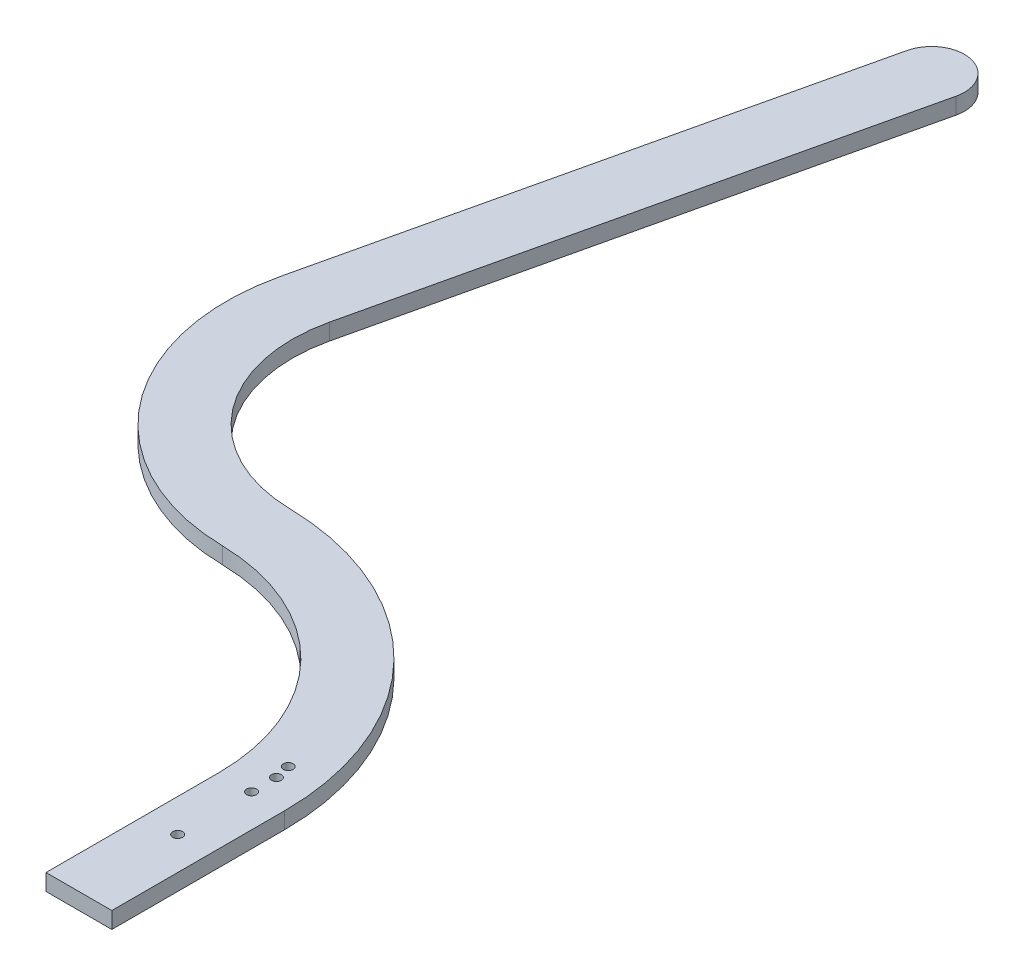
ISO-10303-21;
HEADER;
FILE_DESCRIPTION(('STEP AP214'),'2;1');
FILE_NAME('part.step','',(''),(''),'','','');
FILE_SCHEMA(('AUTOMOTIVE_DESIGN { 1 0 10303 214 1 1 1 1 }'));
ENDSEC;
DATA;
#1=APPLICATION_CONTEXT('core data for automotive mechanical design processes');
#2=APPLICATION_PROTOCOL_DEFINITION('international standard','automotive_design',2000,#1);
#3=PRODUCT_CONTEXT('',#1,'mechanical');
#4=PRODUCT('Part','Part','',(#3));
#5=PRODUCT_RELATED_PRODUCT_CATEGORY('part','',(#4));
#6=PRODUCT_DEFINITION_FORMATION('','',#4);
#7=PRODUCT_DEFINITION_CONTEXT('part definition',#1,'design');
#8=PRODUCT_DEFINITION('design','',#6,#7);
#9=PRODUCT_DEFINITION_SHAPE('','',#8);
#10=(LENGTH_UNIT() NAMED_UNIT(*) SI_UNIT(.MILLI.,.METRE.));
#11=(NAMED_UNIT(*) PLANE_ANGLE_UNIT() SI_UNIT($,.RADIAN.));
#12=(NAMED_UNIT(*) SI_UNIT($,.STERADIAN.) SOLID_ANGLE_UNIT());
#13=UNCERTAINTY_MEASURE_WITH_UNIT(LENGTH_MEASURE(1.E-05),#10,'distance_accuracy_value','');
#14=(GEOMETRIC_REPRESENTATION_CONTEXT(3) GLOBAL_UNCERTAINTY_ASSIGNED_CONTEXT((#13)) GLOBAL_UNIT_ASSIGNED_CONTEXT((#10,
#11,#12)) REPRESENTATION_CONTEXT('',''));
#15=CARTESIAN_POINT('',(0.,0.,0.));
#16=DIRECTION('',(0.,0.,1.));
#17=DIRECTION('',(1.,0.,0.));
#18=AXIS2_PLACEMENT_3D('',#15,#16,#17);
#19=CARTESIAN_POINT('',(-2.42572261724377,5.,125.299605010867));
#20=DIRECTION('',(0.,1.,0.));
#21=DIRECTION('',(0.,0.,1.));
#22=AXIS2_PLACEMENT_3D('',#19,#20,#21);
#23=PLANE('',#22);
#24=CARTESIAN_POINT('',(67.8973604364984,5.,147.743637576767));
#25=DIRECTION('',(0.,1.,0.));
#26=DIRECTION('',(0.,0.,1.));
#27=AXIS2_PLACEMENT_3D('',#24,#25,#26);
#28=CIRCLE('',#27,1.5);
#29=CARTESIAN_POINT('',(67.8973604364984,5.,149.243637576767));
#30=VERTEX_POINT('',#29);
#31=EDGE_CURVE('E225',#30,#30,#28,.T.);
#32=ORIENTED_EDGE('',*,*,#31,.F.);
#33=EDGE_LOOP('',(#32));
#34=FACE_BOUND('',#33,.T.);
#35=CARTESIAN_POINT('',(67.8973604364984,5.,117.743637576767));
#36=DIRECTION('',(0.,1.,0.));
#37=DIRECTION('',(0.,0.,1.));
#38=AXIS2_PLACEMENT_3D('',#35,#36,#37);
#39=CIRCLE('',#38,1.5);
#40=CARTESIAN_POINT('',(67.8973604364984,5.,119.243637576767));
#41=VERTEX_POINT('',#40);
#42=EDGE_CURVE('E219',#41,#41,#39,.T.);
#43=ORIENTED_EDGE('',*,*,#42,.F.);
#44=EDGE_LOOP('',(#43));
#45=FACE_BOUND('',#44,.T.);
#46=CARTESIAN_POINT('',(66.828994789803,5.,113.088129790665));
#47=DIRECTION('',(0.,1.,0.));
#48=DIRECTION('',(0.,0.,1.));
#49=AXIS2_PLACEMENT_3D('',#46,#47,#48);
#50=CIRCLE('',#49,1.50000000000014);
#51=CARTESIAN_POINT('',(66.828994789803,5.,114.588129790665));
#52=VERTEX_POINT('',#51);
#53=EDGE_CURVE('E144',#52,#52,#50,.T.);
#54=ORIENTED_EDGE('',*,*,#53,.F.);
#55=EDGE_LOOP('',(#54));
#56=FACE_BOUND('',#55,.T.);
#57=DIRECTION('',(1.,0.,0.));
#58=VECTOR('',#57,1.);
#59=CARTESIAN_POINT('',(57.8973604364984,5.,177.743637576767));
#60=LINE('',#59,#58);
#61=CARTESIAN_POINT('',(57.8973604364984,5.,177.743637576767));
#62=VERTEX_POINT('',#61);
#63=CARTESIAN_POINT('',(77.8973604364984,5.,177.743637576767));
#64=VERTEX_POINT('',#63);
#65=EDGE_CURVE('E159',#62,#64,#60,.T.);
#66=ORIENTED_EDGE('',*,*,#65,.T.);
#67=DIRECTION('',(0.,0.,-1.));
#68=VECTOR('',#67,1.);
#69=CARTESIAN_POINT('',(77.8973604364984,5.,177.743637576767));
#70=LINE('',#69,#68);
#71=CARTESIAN_POINT('',(77.8973604364984,5.,125.299605010867));
#72=VERTEX_POINT('',#71);
#73=EDGE_CURVE('E97',#64,#72,#70,.T.);
#74=ORIENTED_EDGE('',*,*,#73,.T.);
#75=CARTESIAN_POINT('',(-2.42572261724377,5.,125.299605010867));
#76=DIRECTION('',(0.,1.,0.));
#77=DIRECTION('',(0.,0.,1.));
#78=AXIS2_PLACEMENT_3D('',#75,#76,#77);
#79=CIRCLE('',#78,80.3230830537422);
#80=CARTESIAN_POINT('',(-0.871008876546394,5.,44.9915696940776));
#81=VERTEX_POINT('',#80);
#82=EDGE_CURVE('E180',#72,#81,#79,.T.);
#83=ORIENTED_EDGE('',*,*,#82,.T.);
#84=CARTESIAN_POINT('',(0.,5.,0.));
#85=DIRECTION('',(0.,-1.,0.));
#86=DIRECTION('',(0.,0.,-1.));
#87=AXIS2_PLACEMENT_3D('',#84,#85,#86);
#88=CIRCLE('',#87,45.0000000000007);
#89=CARTESIAN_POINT('',(-43.8444356559802,5.,-10.1323966567018));
#90=VERTEX_POINT('',#89);
#91=EDGE_CURVE('E199',#81,#90,#88,.T.);
#92=ORIENTED_EDGE('',*,*,#91,.T.);
#93=DIRECTION('',(0.225164370148922,0.,-0.974320792355084));
#94=VECTOR('',#93,1.);
#95=CARTESIAN_POINT('',(-8.10911073893205,5.,-164.764632943538));
#96=LINE('',#95,#94);
#97=CARTESIAN_POINT('',(-8.10911073893204,5.,-164.764632943538));
#98=VERTEX_POINT('',#97);
#99=EDGE_CURVE('E196',#90,#98,#96,.T.);
#100=ORIENTED_EDGE('',*,*,#99,.T.);
#101=CARTESIAN_POINT('',(-17.852318662483,5.,-167.016276645027));
#102=DIRECTION('',(0.,1.,0.));
#103=DIRECTION('',(0.,0.,-1.));
#104=AXIS2_PLACEMENT_3D('',#101,#102,#103);
#105=CIRCLE('',#104,10.0000000000001);
#106=CARTESIAN_POINT('',(-27.5955265860339,5.,-169.267920346516));
#107=VERTEX_POINT('',#106);
#108=EDGE_CURVE('E198',#98,#107,#105,.T.);
#109=ORIENTED_EDGE('',*,*,#108,.T.);
#110=DIRECTION('',(-0.225164370148922,0.,0.974320792355084));
#111=VECTOR('',#110,1.);
#112=CARTESIAN_POINT('',(-63.330851503082,5.,-14.6356840596803));
#113=LINE('',#112,#111);
#114=CARTESIAN_POINT('',(-63.3308515030812,5.,-14.6356840596801));
#115=VERTEX_POINT('',#114);
#116=EDGE_CURVE('E122',#107,#115,#113,.T.);
#117=ORIENTED_EDGE('',*,*,#116,.T.);
#118=CARTESIAN_POINT('',(0.,5.,0.));
#119=DIRECTION('',(0.,1.,0.));
#120=DIRECTION('',(0.,0.,1.));
#121=AXIS2_PLACEMENT_3D('',#118,#119,#120);
#122=CIRCLE('',#121,65.0000000000008);
#123=CARTESIAN_POINT('',(-1.25812393278923,5.,64.9878228914444));
#124=VERTEX_POINT('',#123);
#125=EDGE_CURVE('E116',#115,#124,#122,.T.);
#126=ORIENTED_EDGE('',*,*,#125,.T.);
#127=CARTESIAN_POINT('',(-2.42572261724377,5.,125.299605010867));
#128=DIRECTION('',(0.,-1.,0.));
#129=DIRECTION('',(0.,0.,-1.));
#130=AXIS2_PLACEMENT_3D('',#127,#128,#129);
#131=CIRCLE('',#130,60.3230830537422);
#132=CARTESIAN_POINT('',(57.8973604364984,5.,125.299605010867));
#133=VERTEX_POINT('',#132);
#134=EDGE_CURVE('E120',#124,#133,#131,.T.);
#135=ORIENTED_EDGE('',*,*,#134,.T.);
#136=DIRECTION('',(0.,0.,1.));
#137=VECTOR('',#136,1.);
#138=CARTESIAN_POINT('',(57.8973604364984,5.,125.299605010867));
#139=LINE('',#138,#137);
#140=EDGE_CURVE('E48',#133,#62,#139,.T.);
#141=ORIENTED_EDGE('',*,*,#140,.T.);
#142=EDGE_LOOP('',(#66,#74,#83,#92,#100,#109,#117,#126,#135,#141));
#143=FACE_BOUND('',#142,.T.);
#144=CARTESIAN_POINT('',(67.8973604364984,5.,125.299605010867));
#145=DIRECTION('',(0.,1.,0.));
#146=DIRECTION('',(0.,0.,1.));
#147=AXIS2_PLACEMENT_3D('',#144,#145,#146);
#148=CIRCLE('',#147,1.50000000000004);
#149=CARTESIAN_POINT('',(67.8973604364984,5.,126.799605010867));
#150=VERTEX_POINT('',#149);
#151=EDGE_CURVE('E210',#150,#150,#148,.T.);
#152=ORIENTED_EDGE('',*,*,#151,.F.);
#153=EDGE_LOOP('',(#152));
#154=FACE_BOUND('',#153,.T.);
#155=ADVANCED_FACE('F31',(#34,#45,#56,#143,#154),#23,.T.);
#156=CARTESIAN_POINT('',(-2.42572261724377,0.,125.299605010867));
#157=DIRECTION('',(0.,1.,0.));
#158=DIRECTION('',(0.,0.,1.));
#159=AXIS2_PLACEMENT_3D('',#156,#157,#158);
#160=PLANE('',#159);
#161=CARTESIAN_POINT('',(67.8973604364984,0.,147.743637576767));
#162=DIRECTION('',(0.,1.,0.));
#163=DIRECTION('',(0.,0.,1.));
#164=AXIS2_PLACEMENT_3D('',#161,#162,#163);
#165=CIRCLE('',#164,1.5);
#166=CARTESIAN_POINT('',(67.8973604364984,0.,149.243637576767));
#167=VERTEX_POINT('',#166);
#168=EDGE_CURVE('E222',#167,#167,#165,.T.);
#169=ORIENTED_EDGE('',*,*,#168,.T.);
#170=EDGE_LOOP('',(#169));
#171=FACE_BOUND('',#170,.T.);
#172=CARTESIAN_POINT('',(67.8973604364984,0.,117.743637576767));
#173=DIRECTION('',(0.,1.,0.));
#174=DIRECTION('',(0.,0.,1.));
#175=AXIS2_PLACEMENT_3D('',#172,#173,#174);
#176=CIRCLE('',#175,1.5);
#177=CARTESIAN_POINT('',(67.8973604364984,0.,119.243637576767));
#178=VERTEX_POINT('',#177);
#179=EDGE_CURVE('E216',#178,#178,#176,.T.);
#180=ORIENTED_EDGE('',*,*,#179,.T.);
#181=EDGE_LOOP('',(#180));
#182=FACE_BOUND('',#181,.T.);
#183=CARTESIAN_POINT('',(66.828994789803,0.,113.088129790665));
#184=DIRECTION('',(0.,1.,0.));
#185=DIRECTION('',(0.,0.,1.));
#186=AXIS2_PLACEMENT_3D('',#183,#184,#185);
#187=CIRCLE('',#186,1.50000000000014);
#188=CARTESIAN_POINT('',(66.828994789803,0.,114.588129790665));
#189=VERTEX_POINT('',#188);
#190=EDGE_CURVE('E207',#189,#189,#187,.T.);
#191=ORIENTED_EDGE('',*,*,#190,.T.);
#192=EDGE_LOOP('',(#191));
#193=FACE_BOUND('',#192,.T.);
#194=DIRECTION('',(1.,0.,0.));
#195=VECTOR('',#194,1.);
#196=CARTESIAN_POINT('',(57.8973604364984,0.,177.743637576767));
#197=LINE('',#196,#195);
#198=CARTESIAN_POINT('',(57.8973604364984,0.,177.743637576767));
#199=VERTEX_POINT('',#198);
#200=CARTESIAN_POINT('',(77.8973604364984,0.,177.743637576767));
#201=VERTEX_POINT('',#200);
#202=EDGE_CURVE('E140',#199,#201,#197,.T.);
#203=ORIENTED_EDGE('',*,*,#202,.F.);
#204=DIRECTION('',(0.,0.,1.));
#205=VECTOR('',#204,1.);
#206=CARTESIAN_POINT('',(57.8973604364984,0.,125.299605010867));
#207=LINE('',#206,#205);
#208=CARTESIAN_POINT('',(57.8973604364984,0.,125.299605010867));
#209=VERTEX_POINT('',#208);
#210=EDGE_CURVE('E89',#209,#199,#207,.T.);
#211=ORIENTED_EDGE('',*,*,#210,.F.);
#212=CARTESIAN_POINT('',(-2.42572261724377,0.,125.299605010867));
#213=DIRECTION('',(0.,-1.,0.));
#214=DIRECTION('',(0.,0.,-1.));
#215=AXIS2_PLACEMENT_3D('',#212,#213,#214);
#216=CIRCLE('',#215,60.3230830537422);
#217=CARTESIAN_POINT('',(-1.25812393278923,0.,64.9878228914444));
#218=VERTEX_POINT('',#217);
#219=EDGE_CURVE('E83',#218,#209,#216,.T.);
#220=ORIENTED_EDGE('',*,*,#219,.F.);
#221=CARTESIAN_POINT('',(0.,0.,0.));
#222=DIRECTION('',(0.,1.,0.));
#223=DIRECTION('',(0.,0.,1.));
#224=AXIS2_PLACEMENT_3D('',#221,#222,#223);
#225=CIRCLE('',#224,65.0000000000008);
#226=CARTESIAN_POINT('',(-63.3308515030812,0.,-14.6356840596801));
#227=VERTEX_POINT('',#226);
#228=EDGE_CURVE('E130',#227,#218,#225,.T.);
#229=ORIENTED_EDGE('',*,*,#228,.F.);
#230=DIRECTION('',(-0.225164370148922,0.,0.974320792355084));
#231=VECTOR('',#230,1.);
#232=CARTESIAN_POINT('',(-63.330851503082,0.,-14.6356840596803));
#233=LINE('',#232,#231);
#234=CARTESIAN_POINT('',(-27.5955265860339,0.,-169.267920346516));
#235=VERTEX_POINT('',#234);
#236=EDGE_CURVE('E154',#235,#227,#233,.T.);
#237=ORIENTED_EDGE('',*,*,#236,.F.);
#238=CARTESIAN_POINT('',(-17.852318662483,0.,-167.016276645027));
#239=DIRECTION('',(0.,1.,0.));
#240=DIRECTION('',(0.,0.,-1.));
#241=AXIS2_PLACEMENT_3D('',#238,#239,#240);
#242=CIRCLE('',#241,10.0000000000001);
#243=CARTESIAN_POINT('',(-8.10911073893204,0.,-164.764632943538));
#244=VERTEX_POINT('',#243);
#245=EDGE_CURVE('E152',#244,#235,#242,.T.);
#246=ORIENTED_EDGE('',*,*,#245,.F.);
#247=DIRECTION('',(0.225164370148922,0.,-0.974320792355084));
#248=VECTOR('',#247,1.);
#249=CARTESIAN_POINT('',(-8.10911073893205,0.,-164.764632943538));
#250=LINE('',#249,#248);
#251=CARTESIAN_POINT('',(-43.8444356559802,0.,-10.1323966567018));
#252=VERTEX_POINT('',#251);
#253=EDGE_CURVE('E150',#252,#244,#250,.T.);
#254=ORIENTED_EDGE('',*,*,#253,.F.);
#255=CARTESIAN_POINT('',(0.,0.,0.));
#256=DIRECTION('',(0.,-1.,0.));
#257=DIRECTION('',(0.,0.,-1.));
#258=AXIS2_PLACEMENT_3D('',#255,#256,#257);
#259=CIRCLE('',#258,45.0000000000007);
#260=CARTESIAN_POINT('',(-0.871008876546394,0.,44.9915696940776));
#261=VERTEX_POINT('',#260);
#262=EDGE_CURVE('E148',#261,#252,#259,.T.);
#263=ORIENTED_EDGE('',*,*,#262,.F.);
#264=CARTESIAN_POINT('',(-2.42572261724377,0.,125.299605010867));
#265=DIRECTION('',(0.,1.,0.));
#266=DIRECTION('',(0.,0.,1.));
#267=AXIS2_PLACEMENT_3D('',#264,#265,#266);
#268=CIRCLE('',#267,80.3230830537422);
#269=CARTESIAN_POINT('',(77.8973604364984,0.,125.299605010867));
#270=VERTEX_POINT('',#269);
#271=EDGE_CURVE('E146',#270,#261,#268,.T.);
#272=ORIENTED_EDGE('',*,*,#271,.F.);
#273=DIRECTION('',(0.,0.,-1.));
#274=VECTOR('',#273,1.);
#275=CARTESIAN_POINT('',(77.8973604364984,0.,177.743637576767));
#276=LINE('',#275,#274);
#277=EDGE_CURVE('E143',#201,#270,#276,.T.);
#278=ORIENTED_EDGE('',*,*,#277,.F.);
#279=EDGE_LOOP('',(#203,#211,#220,#229,#237,#246,#254,#263,#272,#278));
#280=FACE_BOUND('',#279,.T.);
#281=CARTESIAN_POINT('',(67.8973604364984,0.,125.299605010867));
#282=DIRECTION('',(0.,1.,0.));
#283=DIRECTION('',(0.,0.,1.));
#284=AXIS2_PLACEMENT_3D('',#281,#282,#283);
#285=CIRCLE('',#284,1.50000000000004);
#286=CARTESIAN_POINT('',(67.8973604364984,0.,126.799605010867));
#287=VERTEX_POINT('',#286);
#288=EDGE_CURVE('E213',#287,#287,#285,.T.);
#289=ORIENTED_EDGE('',*,*,#288,.T.);
#290=EDGE_LOOP('',(#289));
#291=FACE_BOUND('',#290,.T.);
#292=ADVANCED_FACE('F184',(#171,#182,#193,#280,#291),#160,.F.);
#293=CARTESIAN_POINT('',(57.8973604364984,5.,177.743637576767));
#294=DIRECTION('',(0.,0.,-1.));
#295=DIRECTION('',(-1.,0.,0.));
#296=AXIS2_PLACEMENT_3D('',#293,#294,#295);
#297=PLANE('',#296);
#298=ORIENTED_EDGE('',*,*,#202,.T.);
#299=DIRECTION('',(0.,-1.,0.));
#300=VECTOR('',#299,1.);
#301=CARTESIAN_POINT('',(77.8973604364984,5.,177.743637576767));
#302=LINE('',#301,#300);
#303=EDGE_CURVE('E11',#64,#201,#302,.T.);
#304=ORIENTED_EDGE('',*,*,#303,.F.);
#305=ORIENTED_EDGE('',*,*,#65,.F.);
#306=DIRECTION('',(0.,-1.,0.));
#307=VECTOR('',#306,1.);
#308=CARTESIAN_POINT('',(57.8973604364984,5.,177.743637576767));
#309=LINE('',#308,#307);
#310=EDGE_CURVE('E136',#62,#199,#309,.T.);
#311=ORIENTED_EDGE('',*,*,#310,.T.);
#312=EDGE_LOOP('',(#298,#304,#305,#311));
#313=FACE_BOUND('',#312,.T.);
#314=ADVANCED_FACE('F33',(#313),#297,.F.);
#315=CARTESIAN_POINT('',(77.8973604364984,5.,177.743637576767));
#316=DIRECTION('',(-1.,0.,0.));
#317=DIRECTION('',(0.,0.,1.));
#318=AXIS2_PLACEMENT_3D('',#315,#316,#317);
#319=PLANE('',#318);
#320=ORIENTED_EDGE('',*,*,#277,.T.);
#321=DIRECTION('',(0.,-1.,0.));
#322=VECTOR('',#321,1.);
#323=CARTESIAN_POINT('',(77.8973604364984,5.,125.299605010867));
#324=LINE('',#323,#322);
#325=EDGE_CURVE('E40',#72,#270,#324,.T.);
#326=ORIENTED_EDGE('',*,*,#325,.F.);
#327=ORIENTED_EDGE('',*,*,#73,.F.);
#328=ORIENTED_EDGE('',*,*,#303,.T.);
#329=EDGE_LOOP('',(#320,#326,#327,#328));
#330=FACE_BOUND('',#329,.T.);
#331=ADVANCED_FACE('F260',(#330),#319,.F.);
#332=CARTESIAN_POINT('',(-2.42572261724377,5.,125.299605010867));
#333=DIRECTION('',(0.,-1.,0.));
#334=DIRECTION('',(0.,0.,-1.));
#335=AXIS2_PLACEMENT_3D('',#332,#333,#334);
#336=CYLINDRICAL_SURFACE('',#335,80.3230830537422);
#337=ORIENTED_EDGE('',*,*,#271,.T.);
#338=DIRECTION('',(0.,-1.,0.));
#339=VECTOR('',#338,1.);
#340=CARTESIAN_POINT('',(-0.871008876546394,5.,44.9915696940776));
#341=LINE('',#340,#339);
#342=EDGE_CURVE('E172',#81,#261,#341,.T.);
#343=ORIENTED_EDGE('',*,*,#342,.F.);
#344=ORIENTED_EDGE('',*,*,#82,.F.);
#345=ORIENTED_EDGE('',*,*,#325,.T.);
#346=EDGE_LOOP('',(#337,#343,#344,#345));
#347=FACE_BOUND('',#346,.T.);
#348=ADVANCED_FACE('F178',(#347),#336,.T.);
#349=CARTESIAN_POINT('',(0.,5.,0.));
#350=DIRECTION('',(0.,-1.,0.));
#351=DIRECTION('',(0.,0.,-1.));
#352=AXIS2_PLACEMENT_3D('',#349,#350,#351);
#353=CYLINDRICAL_SURFACE('',#352,45.0000000000007);
#354=ORIENTED_EDGE('',*,*,#262,.T.);
#355=DIRECTION('',(0.,-1.,0.));
#356=VECTOR('',#355,1.);
#357=CARTESIAN_POINT('',(-43.8444356559802,5.,-10.1323966567018));
#358=LINE('',#357,#356);
#359=EDGE_CURVE('E169',#90,#252,#358,.T.);
#360=ORIENTED_EDGE('',*,*,#359,.F.);
#361=ORIENTED_EDGE('',*,*,#91,.F.);
#362=ORIENTED_EDGE('',*,*,#342,.T.);
#363=EDGE_LOOP('',(#354,#360,#361,#362));
#364=FACE_BOUND('',#363,.T.);
#365=ADVANCED_FACE('F190',(#364),#353,.F.);
#366=CARTESIAN_POINT('',(-8.10911073893205,5.,-164.764632943538));
#367=DIRECTION('',(-0.974320792355084,0.,-0.225164370148922));
#368=DIRECTION('',(-0.225164370148922,0.,0.974320792355084));
#369=AXIS2_PLACEMENT_3D('',#366,#367,#368);
#370=PLANE('',#369);
#371=ORIENTED_EDGE('',*,*,#253,.T.);
#372=DIRECTION('',(0.,-1.,0.));
#373=VECTOR('',#372,1.);
#374=CARTESIAN_POINT('',(-8.10911073893204,5.,-164.764632943538));
#375=LINE('',#374,#373);
#376=EDGE_CURVE('E166',#98,#244,#375,.T.);
#377=ORIENTED_EDGE('',*,*,#376,.F.);
#378=ORIENTED_EDGE('',*,*,#99,.F.);
#379=ORIENTED_EDGE('',*,*,#359,.T.);
#380=EDGE_LOOP('',(#371,#377,#378,#379));
#381=FACE_BOUND('',#380,.T.);
#382=ADVANCED_FACE('F194',(#381),#370,.F.);
#383=CARTESIAN_POINT('',(-17.852318662483,5.,-167.016276645027));
#384=DIRECTION('',(0.,-1.,0.));
#385=DIRECTION('',(0.,0.,-1.));
#386=AXIS2_PLACEMENT_3D('',#383,#384,#385);
#387=CYLINDRICAL_SURFACE('',#386,10.0000000000001);
#388=ORIENTED_EDGE('',*,*,#245,.T.);
#389=DIRECTION('',(0.,-1.,0.));
#390=VECTOR('',#389,1.);
#391=CARTESIAN_POINT('',(-27.5955265860339,5.,-169.267920346516));
#392=LINE('',#391,#390);
#393=EDGE_CURVE('E163',#107,#235,#392,.T.);
#394=ORIENTED_EDGE('',*,*,#393,.F.);
#395=ORIENTED_EDGE('',*,*,#108,.F.);
#396=ORIENTED_EDGE('',*,*,#376,.T.);
#397=EDGE_LOOP('',(#388,#394,#395,#396));
#398=FACE_BOUND('',#397,.T.);
#399=ADVANCED_FACE('F272',(#398),#387,.T.);
#400=CARTESIAN_POINT('',(-63.330851503082,5.,-14.6356840596803));
#401=DIRECTION('',(0.974320792355084,0.,0.225164370148922));
#402=DIRECTION('',(0.225164370148922,0.,-0.974320792355084));
#403=AXIS2_PLACEMENT_3D('',#400,#401,#402);
#404=PLANE('',#403);
#405=ORIENTED_EDGE('',*,*,#236,.T.);
#406=DIRECTION('',(0.,-1.,0.));
#407=VECTOR('',#406,1.);
#408=CARTESIAN_POINT('',(-63.3308515030812,5.,-14.6356840596801));
#409=LINE('',#408,#407);
#410=EDGE_CURVE('E131',#115,#227,#409,.T.);
#411=ORIENTED_EDGE('',*,*,#410,.F.);
#412=ORIENTED_EDGE('',*,*,#116,.F.);
#413=ORIENTED_EDGE('',*,*,#393,.T.);
#414=EDGE_LOOP('',(#405,#411,#412,#413));
#415=FACE_BOUND('',#414,.T.);
#416=ADVANCED_FACE('F269',(#415),#404,.F.);
#417=CARTESIAN_POINT('',(0.,5.,0.));
#418=DIRECTION('',(0.,-1.,0.));
#419=DIRECTION('',(0.,0.,-1.));
#420=AXIS2_PLACEMENT_3D('',#417,#418,#419);
#421=CYLINDRICAL_SURFACE('',#420,65.0000000000008);
#422=ORIENTED_EDGE('',*,*,#228,.T.);
#423=DIRECTION('',(0.,-1.,0.));
#424=VECTOR('',#423,1.);
#425=CARTESIAN_POINT('',(-1.25812393278923,5.,64.9878228914444));
#426=LINE('',#425,#424);
#427=EDGE_CURVE('E127',#124,#218,#426,.T.);
#428=ORIENTED_EDGE('',*,*,#427,.F.);
#429=ORIENTED_EDGE('',*,*,#125,.F.);
#430=ORIENTED_EDGE('',*,*,#410,.T.);
#431=EDGE_LOOP('',(#422,#428,#429,#430));
#432=FACE_BOUND('',#431,.T.);
#433=ADVANCED_FACE('F128',(#432),#421,.T.);
#434=CARTESIAN_POINT('',(-2.42572261724377,5.,125.299605010867));
#435=DIRECTION('',(0.,-1.,0.));
#436=DIRECTION('',(0.,0.,-1.));
#437=AXIS2_PLACEMENT_3D('',#434,#435,#436);
#438=CYLINDRICAL_SURFACE('',#437,60.3230830537422);
#439=ORIENTED_EDGE('',*,*,#219,.T.);
#440=DIRECTION('',(0.,-1.,0.));
#441=VECTOR('',#440,1.);
#442=CARTESIAN_POINT('',(57.8973604364984,5.,125.299605010867));
#443=LINE('',#442,#441);
#444=EDGE_CURVE('E132',#133,#209,#443,.T.);
#445=ORIENTED_EDGE('',*,*,#444,.F.);
#446=ORIENTED_EDGE('',*,*,#134,.F.);
#447=ORIENTED_EDGE('',*,*,#427,.T.);
#448=EDGE_LOOP('',(#439,#445,#446,#447));
#449=FACE_BOUND('',#448,.T.);
#450=ADVANCED_FACE('F134',(#449),#438,.F.);
#451=CARTESIAN_POINT('',(57.8973604364984,5.,125.299605010867));
#452=DIRECTION('',(1.,0.,0.));
#453=DIRECTION('',(0.,0.,-1.));
#454=AXIS2_PLACEMENT_3D('',#451,#452,#453);
#455=PLANE('',#454);
#456=ORIENTED_EDGE('',*,*,#210,.T.);
#457=ORIENTED_EDGE('',*,*,#310,.F.);
#458=ORIENTED_EDGE('',*,*,#140,.F.);
#459=ORIENTED_EDGE('',*,*,#444,.T.);
#460=EDGE_LOOP('',(#456,#457,#458,#459));
#461=FACE_BOUND('',#460,.T.);
#462=ADVANCED_FACE('F251',(#461),#455,.F.);
#463=CARTESIAN_POINT('',(66.828994789803,5.,113.088129790665));
#464=DIRECTION('',(0.,-1.,0.));
#465=DIRECTION('',(0.,0.,-1.));
#466=AXIS2_PLACEMENT_3D('',#463,#464,#465);
#467=CYLINDRICAL_SURFACE('',#466,1.50000000000014);
#468=ORIENTED_EDGE('',*,*,#53,.T.);
#469=EDGE_LOOP('',(#468));
#470=FACE_BOUND('',#469,.T.);
#471=ORIENTED_EDGE('',*,*,#190,.F.);
#472=EDGE_LOOP('',(#471));
#473=FACE_BOUND('',#472,.T.);
#474=ADVANCED_FACE('F247',(#470,#473),#467,.F.);
#475=CARTESIAN_POINT('',(67.8973604364984,5.,125.299605010867));
#476=DIRECTION('',(0.,-1.,0.));
#477=DIRECTION('',(0.,0.,-1.));
#478=AXIS2_PLACEMENT_3D('',#475,#476,#477);
#479=CYLINDRICAL_SURFACE('',#478,1.50000000000004);
#480=ORIENTED_EDGE('',*,*,#151,.T.);
#481=EDGE_LOOP('',(#480));
#482=FACE_BOUND('',#481,.T.);
#483=ORIENTED_EDGE('',*,*,#288,.F.);
#484=EDGE_LOOP('',(#483));
#485=FACE_BOUND('',#484,.T.);
#486=ADVANCED_FACE('F250',(#482,#485),#479,.F.);
#487=CARTESIAN_POINT('',(67.8973604364984,0.,117.743637576767));
#488=DIRECTION('',(0.,1.,0.));
#489=DIRECTION('',(0.,0.,1.));
#490=AXIS2_PLACEMENT_3D('',#487,#488,#489);
#491=CYLINDRICAL_SURFACE('',#490,1.5);
#492=ORIENTED_EDGE('',*,*,#179,.F.);
#493=EDGE_LOOP('',(#492));
#494=FACE_BOUND('',#493,.T.);
#495=ORIENTED_EDGE('',*,*,#42,.T.);
#496=EDGE_LOOP('',(#495));
#497=FACE_BOUND('',#496,.T.);
#498=ADVANCED_FACE('F236',(#494,#497),#491,.F.);
#499=CARTESIAN_POINT('',(67.8973604364984,0.,147.743637576767));
#500=DIRECTION('',(0.,1.,0.));
#501=DIRECTION('',(0.,0.,1.));
#502=AXIS2_PLACEMENT_3D('',#499,#500,#501);
#503=CYLINDRICAL_SURFACE('',#502,1.5);
#504=ORIENTED_EDGE('',*,*,#168,.F.);
#505=EDGE_LOOP('',(#504));
#506=FACE_BOUND('',#505,.T.);
#507=ORIENTED_EDGE('',*,*,#31,.T.);
#508=EDGE_LOOP('',(#507));
#509=FACE_BOUND('',#508,.T.);
#510=ADVANCED_FACE('F233',(#506,#509),#503,.F.);
#511=CLOSED_SHELL('',(#155,#292,#314,#331,#348,#365,#382,#399,#416,#433,#450,#462,#474,#486,
#498,#510));
#512=MANIFOLD_SOLID_BREP('B2',#511);
#513=ADVANCED_BREP_SHAPE_REPRESENTATION('',(#18,#512),#14);
#514=SHAPE_DEFINITION_REPRESENTATION(#9,#513);
ENDSEC;
END-ISO-10303-21;
